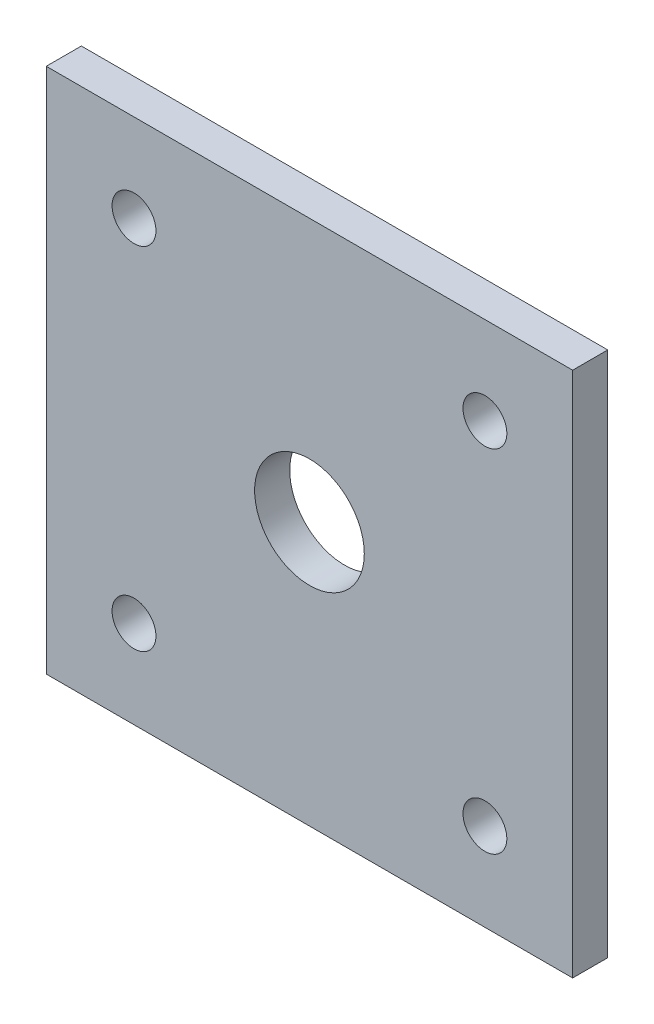
ISO-10303-21;
HEADER;
FILE_DESCRIPTION(('STEP AP214'),'2;1');
FILE_NAME('part.step','',(''),(''),'','','');
FILE_SCHEMA(('AUTOMOTIVE_DESIGN { 1 0 10303 214 1 1 1 1 }'));
ENDSEC;
DATA;
#1=APPLICATION_CONTEXT('core data for automotive mechanical design processes');
#2=APPLICATION_PROTOCOL_DEFINITION('international standard','automotive_design',2000,#1);
#3=PRODUCT_CONTEXT('',#1,'mechanical');
#4=PRODUCT('Part','Part','',(#3));
#5=PRODUCT_RELATED_PRODUCT_CATEGORY('part','',(#4));
#6=PRODUCT_DEFINITION_FORMATION('','',#4);
#7=PRODUCT_DEFINITION_CONTEXT('part definition',#1,'design');
#8=PRODUCT_DEFINITION('design','',#6,#7);
#9=PRODUCT_DEFINITION_SHAPE('','',#8);
#10=(LENGTH_UNIT() NAMED_UNIT(*) SI_UNIT(.MILLI.,.METRE.));
#11=(NAMED_UNIT(*) PLANE_ANGLE_UNIT() SI_UNIT($,.RADIAN.));
#12=(NAMED_UNIT(*) SI_UNIT($,.STERADIAN.) SOLID_ANGLE_UNIT());
#13=UNCERTAINTY_MEASURE_WITH_UNIT(LENGTH_MEASURE(1.E-05),#10,'distance_accuracy_value','');
#14=(GEOMETRIC_REPRESENTATION_CONTEXT(3) GLOBAL_UNCERTAINTY_ASSIGNED_CONTEXT((#13)) GLOBAL_UNIT_ASSIGNED_CONTEXT((#10,
#11,#12)) REPRESENTATION_CONTEXT('',''));
#15=CARTESIAN_POINT('',(0.,0.,0.));
#16=DIRECTION('',(0.,0.,1.));
#17=DIRECTION('',(1.,0.,0.));
#18=AXIS2_PLACEMENT_3D('',#15,#16,#17);
#19=CARTESIAN_POINT('',(60.,60.,8.));
#20=DIRECTION('',(-1.,0.,0.));
#21=DIRECTION('',(0.,-1.,0.));
#22=AXIS2_PLACEMENT_3D('',#19,#20,#21);
#23=PLANE('',#22);
#24=DIRECTION('',(0.,1.,0.));
#25=VECTOR('',#24,1.);
#26=CARTESIAN_POINT('',(60.,60.,0.));
#27=LINE('',#26,#25);
#28=CARTESIAN_POINT('',(60.,-60.,0.));
#29=VERTEX_POINT('',#28);
#30=CARTESIAN_POINT('',(60.,60.,0.));
#31=VERTEX_POINT('',#30);
#32=EDGE_CURVE('E101',#29,#31,#27,.T.);
#33=ORIENTED_EDGE('',*,*,#32,.T.);
#34=DIRECTION('',(0.,0.,-1.));
#35=VECTOR('',#34,1.);
#36=CARTESIAN_POINT('',(60.,60.,8.));
#37=LINE('',#36,#35);
#38=CARTESIAN_POINT('',(60.,60.,8.));
#39=VERTEX_POINT('',#38);
#40=EDGE_CURVE('E92',#39,#31,#37,.T.);
#41=ORIENTED_EDGE('',*,*,#40,.F.);
#42=DIRECTION('',(0.,1.,0.));
#43=VECTOR('',#42,1.);
#44=CARTESIAN_POINT('',(60.,60.,8.));
#45=LINE('',#44,#43);
#46=CARTESIAN_POINT('',(60.,-60.,8.));
#47=VERTEX_POINT('',#46);
#48=EDGE_CURVE('E86',#47,#39,#45,.T.);
#49=ORIENTED_EDGE('',*,*,#48,.F.);
#50=DIRECTION('',(0.,0.,-1.));
#51=VECTOR('',#50,1.);
#52=CARTESIAN_POINT('',(60.,-60.,8.));
#53=LINE('',#52,#51);
#54=EDGE_CURVE('E97',#47,#29,#53,.T.);
#55=ORIENTED_EDGE('',*,*,#54,.T.);
#56=EDGE_LOOP('',(#33,#41,#49,#55));
#57=FACE_BOUND('',#56,.T.);
#58=ADVANCED_FACE('F32',(#57),#23,.F.);
#59=CARTESIAN_POINT('',(-60.,60.,8.));
#60=DIRECTION('',(0.,-1.,0.));
#61=DIRECTION('',(0.,0.,-1.));
#62=AXIS2_PLACEMENT_3D('',#59,#60,#61);
#63=PLANE('',#62);
#64=DIRECTION('',(-1.,0.,0.));
#65=VECTOR('',#64,1.);
#66=CARTESIAN_POINT('',(-60.,60.,0.));
#67=LINE('',#66,#65);
#68=CARTESIAN_POINT('',(-60.,60.,0.));
#69=VERTEX_POINT('',#68);
#70=EDGE_CURVE('E91',#31,#69,#67,.T.);
#71=ORIENTED_EDGE('',*,*,#70,.T.);
#72=DIRECTION('',(0.,0.,-1.));
#73=VECTOR('',#72,1.);
#74=CARTESIAN_POINT('',(-60.,60.,8.));
#75=LINE('',#74,#73);
#76=CARTESIAN_POINT('',(-60.,60.,8.));
#77=VERTEX_POINT('',#76);
#78=EDGE_CURVE('E89',#77,#69,#75,.T.);
#79=ORIENTED_EDGE('',*,*,#78,.F.);
#80=DIRECTION('',(-1.,0.,0.));
#81=VECTOR('',#80,1.);
#82=CARTESIAN_POINT('',(-60.,60.,8.));
#83=LINE('',#82,#81);
#84=EDGE_CURVE('E80',#39,#77,#83,.T.);
#85=ORIENTED_EDGE('',*,*,#84,.F.);
#86=ORIENTED_EDGE('',*,*,#40,.T.);
#87=EDGE_LOOP('',(#71,#79,#85,#86));
#88=FACE_BOUND('',#87,.T.);
#89=ADVANCED_FACE('F90',(#88),#63,.F.);
#90=CARTESIAN_POINT('',(-60.,60.,8.));
#91=DIRECTION('',(1.,0.,0.));
#92=DIRECTION('',(0.,1.,0.));
#93=AXIS2_PLACEMENT_3D('',#90,#91,#92);
#94=PLANE('',#93);
#95=DIRECTION('',(0.,-1.,0.));
#96=VECTOR('',#95,1.);
#97=CARTESIAN_POINT('',(-60.,60.,0.));
#98=LINE('',#97,#96);
#99=CARTESIAN_POINT('',(-60.,-60.,0.));
#100=VERTEX_POINT('',#99);
#101=EDGE_CURVE('E66',#69,#100,#98,.T.);
#102=ORIENTED_EDGE('',*,*,#101,.T.);
#103=DIRECTION('',(0.,0.,-1.));
#104=VECTOR('',#103,1.);
#105=CARTESIAN_POINT('',(-60.,-60.,8.));
#106=LINE('',#105,#104);
#107=CARTESIAN_POINT('',(-60.,-60.,8.));
#108=VERTEX_POINT('',#107);
#109=EDGE_CURVE('E93',#108,#100,#106,.T.);
#110=ORIENTED_EDGE('',*,*,#109,.F.);
#111=DIRECTION('',(0.,-1.,0.));
#112=VECTOR('',#111,1.);
#113=CARTESIAN_POINT('',(-60.,60.,8.));
#114=LINE('',#113,#112);
#115=EDGE_CURVE('E84',#77,#108,#114,.T.);
#116=ORIENTED_EDGE('',*,*,#115,.F.);
#117=ORIENTED_EDGE('',*,*,#78,.T.);
#118=EDGE_LOOP('',(#102,#110,#116,#117));
#119=FACE_BOUND('',#118,.T.);
#120=ADVANCED_FACE('F95',(#119),#94,.F.);
#121=CARTESIAN_POINT('',(-60.,-60.,8.));
#122=DIRECTION('',(0.,1.,0.));
#123=DIRECTION('',(0.,0.,1.));
#124=AXIS2_PLACEMENT_3D('',#121,#122,#123);
#125=PLANE('',#124);
#126=DIRECTION('',(1.,0.,0.));
#127=VECTOR('',#126,1.);
#128=CARTESIAN_POINT('',(-60.,-60.,0.));
#129=LINE('',#128,#127);
#130=EDGE_CURVE('E72',#100,#29,#129,.T.);
#131=ORIENTED_EDGE('',*,*,#130,.T.);
#132=ORIENTED_EDGE('',*,*,#54,.F.);
#133=DIRECTION('',(1.,0.,0.));
#134=VECTOR('',#133,1.);
#135=CARTESIAN_POINT('',(-60.,-60.,8.));
#136=LINE('',#135,#134);
#137=EDGE_CURVE('E49',#108,#47,#136,.T.);
#138=ORIENTED_EDGE('',*,*,#137,.F.);
#139=ORIENTED_EDGE('',*,*,#109,.T.);
#140=EDGE_LOOP('',(#131,#132,#138,#139));
#141=FACE_BOUND('',#140,.T.);
#142=ADVANCED_FACE('F128',(#141),#125,.F.);
#143=CARTESIAN_POINT('',(0.,0.,8.));
#144=DIRECTION('',(0.,0.,1.));
#145=DIRECTION('',(1.,0.,0.));
#146=AXIS2_PLACEMENT_3D('',#143,#144,#145);
#147=PLANE('',#146);
#148=CARTESIAN_POINT('',(0.,0.,8.));
#149=DIRECTION('',(0.,0.,1.));
#150=DIRECTION('',(1.,0.,0.));
#151=AXIS2_PLACEMENT_3D('',#148,#149,#150);
#152=CIRCLE('',#151,12.5);
#153=CARTESIAN_POINT('',(12.5,0.,8.));
#154=VERTEX_POINT('',#153);
#155=EDGE_CURVE('E178',#154,#154,#152,.T.);
#156=ORIENTED_EDGE('',*,*,#155,.F.);
#157=EDGE_LOOP('',(#156));
#158=FACE_BOUND('',#157,.T.);
#159=CARTESIAN_POINT('',(40.,40.,8.));
#160=DIRECTION('',(0.,0.,1.));
#161=DIRECTION('',(1.,0.,0.));
#162=AXIS2_PLACEMENT_3D('',#159,#160,#161);
#163=CIRCLE('',#162,5.);
#164=CARTESIAN_POINT('',(45.,40.,8.));
#165=VERTEX_POINT('',#164);
#166=EDGE_CURVE('E185',#165,#165,#163,.T.);
#167=ORIENTED_EDGE('',*,*,#166,.F.);
#168=EDGE_LOOP('',(#167));
#169=FACE_BOUND('',#168,.T.);
#170=CARTESIAN_POINT('',(-40.,40.,8.));
#171=DIRECTION('',(0.,0.,1.));
#172=DIRECTION('',(1.,0.,0.));
#173=AXIS2_PLACEMENT_3D('',#170,#171,#172);
#174=CIRCLE('',#173,5.);
#175=CARTESIAN_POINT('',(-35.,40.,8.));
#176=VERTEX_POINT('',#175);
#177=EDGE_CURVE('E188',#176,#176,#174,.T.);
#178=ORIENTED_EDGE('',*,*,#177,.F.);
#179=EDGE_LOOP('',(#178));
#180=FACE_BOUND('',#179,.T.);
#181=ORIENTED_EDGE('',*,*,#48,.T.);
#182=ORIENTED_EDGE('',*,*,#84,.T.);
#183=ORIENTED_EDGE('',*,*,#115,.T.);
#184=ORIENTED_EDGE('',*,*,#137,.T.);
#185=EDGE_LOOP('',(#181,#182,#183,#184));
#186=FACE_BOUND('',#185,.T.);
#187=CARTESIAN_POINT('',(-40.,-40.,8.));
#188=DIRECTION('',(0.,0.,1.));
#189=DIRECTION('',(1.,0.,0.));
#190=AXIS2_PLACEMENT_3D('',#187,#188,#189);
#191=CIRCLE('',#190,5.);
#192=CARTESIAN_POINT('',(-35.,-40.,8.));
#193=VERTEX_POINT('',#192);
#194=EDGE_CURVE('E114',#193,#193,#191,.T.);
#195=ORIENTED_EDGE('',*,*,#194,.F.);
#196=EDGE_LOOP('',(#195));
#197=FACE_BOUND('',#196,.T.);
#198=CARTESIAN_POINT('',(40.,-40.,8.));
#199=DIRECTION('',(0.,0.,1.));
#200=DIRECTION('',(1.,0.,0.));
#201=AXIS2_PLACEMENT_3D('',#198,#199,#200);
#202=CIRCLE('',#201,5.);
#203=CARTESIAN_POINT('',(45.,-40.,8.));
#204=VERTEX_POINT('',#203);
#205=EDGE_CURVE('E11',#204,#204,#202,.T.);
#206=ORIENTED_EDGE('',*,*,#205,.F.);
#207=EDGE_LOOP('',(#206));
#208=FACE_BOUND('',#207,.T.);
#209=ADVANCED_FACE('F81',(#158,#169,#180,#186,#197,#208),#147,.T.);
#210=CARTESIAN_POINT('',(0.,0.,0.));
#211=DIRECTION('',(0.,0.,1.));
#212=DIRECTION('',(1.,0.,0.));
#213=AXIS2_PLACEMENT_3D('',#210,#211,#212);
#214=PLANE('',#213);
#215=CARTESIAN_POINT('',(0.,0.,0.));
#216=DIRECTION('',(0.,0.,1.));
#217=DIRECTION('',(1.,0.,0.));
#218=AXIS2_PLACEMENT_3D('',#215,#216,#217);
#219=CIRCLE('',#218,12.5);
#220=CARTESIAN_POINT('',(12.5,0.,0.));
#221=VERTEX_POINT('',#220);
#222=EDGE_CURVE('E176',#221,#221,#219,.T.);
#223=ORIENTED_EDGE('',*,*,#222,.T.);
#224=EDGE_LOOP('',(#223));
#225=FACE_BOUND('',#224,.T.);
#226=CARTESIAN_POINT('',(40.,40.,0.));
#227=DIRECTION('',(0.,0.,1.));
#228=DIRECTION('',(1.,0.,0.));
#229=AXIS2_PLACEMENT_3D('',#226,#227,#228);
#230=CIRCLE('',#229,5.);
#231=CARTESIAN_POINT('',(45.,40.,0.));
#232=VERTEX_POINT('',#231);
#233=EDGE_CURVE('E180',#232,#232,#230,.T.);
#234=ORIENTED_EDGE('',*,*,#233,.T.);
#235=EDGE_LOOP('',(#234));
#236=FACE_BOUND('',#235,.T.);
#237=CARTESIAN_POINT('',(-40.,40.,0.));
#238=DIRECTION('',(0.,0.,1.));
#239=DIRECTION('',(1.,0.,0.));
#240=AXIS2_PLACEMENT_3D('',#237,#238,#239);
#241=CIRCLE('',#240,5.);
#242=CARTESIAN_POINT('',(-35.,40.,0.));
#243=VERTEX_POINT('',#242);
#244=EDGE_CURVE('E104',#243,#243,#241,.T.);
#245=ORIENTED_EDGE('',*,*,#244,.T.);
#246=EDGE_LOOP('',(#245));
#247=FACE_BOUND('',#246,.T.);
#248=ORIENTED_EDGE('',*,*,#32,.F.);
#249=ORIENTED_EDGE('',*,*,#130,.F.);
#250=ORIENTED_EDGE('',*,*,#101,.F.);
#251=ORIENTED_EDGE('',*,*,#70,.F.);
#252=EDGE_LOOP('',(#248,#249,#250,#251));
#253=FACE_BOUND('',#252,.T.);
#254=CARTESIAN_POINT('',(-40.,-40.,0.));
#255=DIRECTION('',(0.,0.,1.));
#256=DIRECTION('',(1.,0.,0.));
#257=AXIS2_PLACEMENT_3D('',#254,#255,#256);
#258=CIRCLE('',#257,5.);
#259=CARTESIAN_POINT('',(-35.,-40.,0.));
#260=VERTEX_POINT('',#259);
#261=EDGE_CURVE('E111',#260,#260,#258,.T.);
#262=ORIENTED_EDGE('',*,*,#261,.T.);
#263=EDGE_LOOP('',(#262));
#264=FACE_BOUND('',#263,.T.);
#265=CARTESIAN_POINT('',(40.,-40.,0.));
#266=DIRECTION('',(0.,0.,1.));
#267=DIRECTION('',(1.,0.,0.));
#268=AXIS2_PLACEMENT_3D('',#265,#266,#267);
#269=CIRCLE('',#268,5.);
#270=CARTESIAN_POINT('',(45.,-40.,0.));
#271=VERTEX_POINT('',#270);
#272=EDGE_CURVE('E41',#271,#271,#269,.T.);
#273=ORIENTED_EDGE('',*,*,#272,.T.);
#274=EDGE_LOOP('',(#273));
#275=FACE_BOUND('',#274,.T.);
#276=ADVANCED_FACE('F119',(#225,#236,#247,#253,#264,#275),#214,.F.);
#277=CARTESIAN_POINT('',(-40.,40.,0.));
#278=DIRECTION('',(0.,0.,1.));
#279=DIRECTION('',(1.,0.,0.));
#280=AXIS2_PLACEMENT_3D('',#277,#278,#279);
#281=CYLINDRICAL_SURFACE('',#280,5.);
#282=ORIENTED_EDGE('',*,*,#244,.F.);
#283=EDGE_LOOP('',(#282));
#284=FACE_BOUND('',#283,.T.);
#285=ORIENTED_EDGE('',*,*,#177,.T.);
#286=EDGE_LOOP('',(#285));
#287=FACE_BOUND('',#286,.T.);
#288=ADVANCED_FACE('F135',(#284,#287),#281,.F.);
#289=CARTESIAN_POINT('',(40.,40.,0.));
#290=DIRECTION('',(0.,0.,1.));
#291=DIRECTION('',(1.,0.,0.));
#292=AXIS2_PLACEMENT_3D('',#289,#290,#291);
#293=CYLINDRICAL_SURFACE('',#292,5.);
#294=ORIENTED_EDGE('',*,*,#233,.F.);
#295=EDGE_LOOP('',(#294));
#296=FACE_BOUND('',#295,.T.);
#297=ORIENTED_EDGE('',*,*,#166,.T.);
#298=EDGE_LOOP('',(#297));
#299=FACE_BOUND('',#298,.T.);
#300=ADVANCED_FACE('F151',(#296,#299),#293,.F.);
#301=CARTESIAN_POINT('',(-40.,-40.,0.));
#302=DIRECTION('',(0.,0.,1.));
#303=DIRECTION('',(1.,0.,0.));
#304=AXIS2_PLACEMENT_3D('',#301,#302,#303);
#305=CYLINDRICAL_SURFACE('',#304,5.);
#306=ORIENTED_EDGE('',*,*,#261,.F.);
#307=EDGE_LOOP('',(#306));
#308=FACE_BOUND('',#307,.T.);
#309=ORIENTED_EDGE('',*,*,#194,.T.);
#310=EDGE_LOOP('',(#309));
#311=FACE_BOUND('',#310,.T.);
#312=ADVANCED_FACE('F124',(#308,#311),#305,.F.);
#313=CARTESIAN_POINT('',(40.,-40.,0.));
#314=DIRECTION('',(0.,0.,1.));
#315=DIRECTION('',(1.,0.,0.));
#316=AXIS2_PLACEMENT_3D('',#313,#314,#315);
#317=CYLINDRICAL_SURFACE('',#316,5.);
#318=ORIENTED_EDGE('',*,*,#272,.F.);
#319=EDGE_LOOP('',(#318));
#320=FACE_BOUND('',#319,.T.);
#321=ORIENTED_EDGE('',*,*,#205,.T.);
#322=EDGE_LOOP('',(#321));
#323=FACE_BOUND('',#322,.T.);
#324=ADVANCED_FACE('F34',(#320,#323),#317,.F.);
#325=CARTESIAN_POINT('',(0.,0.,0.));
#326=DIRECTION('',(0.,0.,1.));
#327=DIRECTION('',(1.,0.,0.));
#328=AXIS2_PLACEMENT_3D('',#325,#326,#327);
#329=CYLINDRICAL_SURFACE('',#328,12.5);
#330=ORIENTED_EDGE('',*,*,#222,.F.);
#331=EDGE_LOOP('',(#330));
#332=FACE_BOUND('',#331,.T.);
#333=ORIENTED_EDGE('',*,*,#155,.T.);
#334=EDGE_LOOP('',(#333));
#335=FACE_BOUND('',#334,.T.);
#336=ADVANCED_FACE('F123',(#332,#335),#329,.F.);
#337=CLOSED_SHELL('',(#58,#89,#120,#142,#209,#276,#288,#300,#312,#324,#336));
#338=MANIFOLD_SOLID_BREP('B2',#337);
#339=ADVANCED_BREP_SHAPE_REPRESENTATION('',(#18,#338),#14);
#340=SHAPE_DEFINITION_REPRESENTATION(#9,#339);
ENDSEC;
END-ISO-10303-21;
